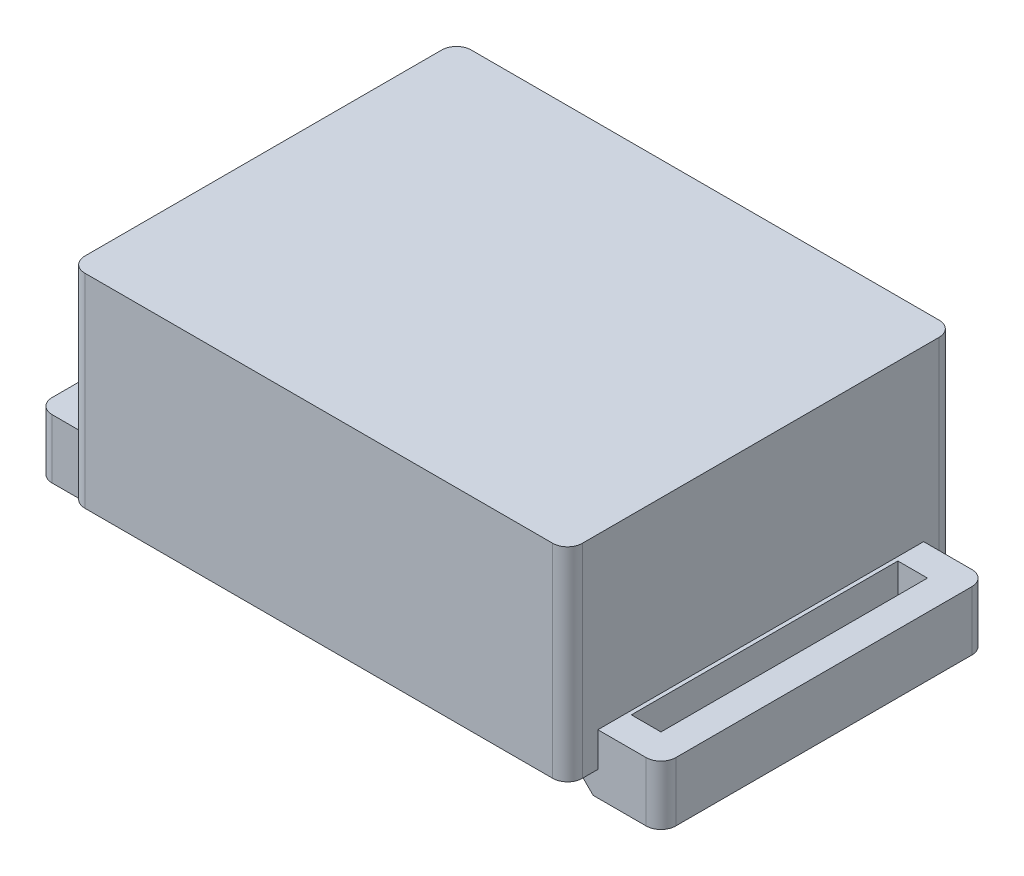
ISO-10303-21;
HEADER;
FILE_DESCRIPTION(('STEP AP214'),'2;1');
FILE_NAME('part.step','',(''),(''),'','','');
FILE_SCHEMA(('AUTOMOTIVE_DESIGN { 1 0 10303 214 1 1 1 1 }'));
ENDSEC;
DATA;
#1=APPLICATION_CONTEXT('core data for automotive mechanical design processes');
#2=APPLICATION_PROTOCOL_DEFINITION('international standard','automotive_design',2000,#1);
#3=PRODUCT_CONTEXT('',#1,'mechanical');
#4=PRODUCT('Part','Part','',(#3));
#5=PRODUCT_RELATED_PRODUCT_CATEGORY('part','',(#4));
#6=PRODUCT_DEFINITION_FORMATION('','',#4);
#7=PRODUCT_DEFINITION_CONTEXT('part definition',#1,'design');
#8=PRODUCT_DEFINITION('design','',#6,#7);
#9=PRODUCT_DEFINITION_SHAPE('','',#8);
#10=(LENGTH_UNIT() NAMED_UNIT(*) SI_UNIT(.MILLI.,.METRE.));
#11=(NAMED_UNIT(*) PLANE_ANGLE_UNIT() SI_UNIT($,.RADIAN.));
#12=(NAMED_UNIT(*) SI_UNIT($,.STERADIAN.) SOLID_ANGLE_UNIT());
#13=UNCERTAINTY_MEASURE_WITH_UNIT(LENGTH_MEASURE(1.E-05),#10,'distance_accuracy_value','');
#14=(GEOMETRIC_REPRESENTATION_CONTEXT(3) GLOBAL_UNCERTAINTY_ASSIGNED_CONTEXT((#13)) GLOBAL_UNIT_ASSIGNED_CONTEXT((#10,
#11,#12)) REPRESENTATION_CONTEXT('',''));
#15=CARTESIAN_POINT('',(0.,0.,0.));
#16=DIRECTION('',(0.,0.,1.));
#17=DIRECTION('',(1.,0.,0.));
#18=AXIS2_PLACEMENT_3D('',#15,#16,#17);
#19=CARTESIAN_POINT('',(-16.8,13.75,13.05));
#20=DIRECTION('',(1.,0.,0.));
#21=DIRECTION('',(0.,0.,-1.));
#22=AXIS2_PLACEMENT_3D('',#19,#20,#21);
#23=PLANE('',#22);
#24=DIRECTION('',(0.,0.,1.));
#25=VECTOR('',#24,1.);
#26=CARTESIAN_POINT('',(-16.8,13.75,13.05));
#27=LINE('',#26,#25);
#28=CARTESIAN_POINT('',(-16.8,13.75,-12.05));
#29=VERTEX_POINT('',#28);
#30=CARTESIAN_POINT('',(-16.8,13.75,12.05));
#31=VERTEX_POINT('',#30);
#32=EDGE_CURVE('E376',#29,#31,#27,.T.);
#33=ORIENTED_EDGE('',*,*,#32,.F.);
#34=DIRECTION('',(0.,-1.,0.));
#35=VECTOR('',#34,1.);
#36=CARTESIAN_POINT('',(-16.8,13.75,-12.05));
#37=LINE('',#36,#35);
#38=CARTESIAN_POINT('',(-16.8,0.,-12.05));
#39=VERTEX_POINT('',#38);
#40=EDGE_CURVE('E11',#29,#39,#37,.T.);
#41=ORIENTED_EDGE('',*,*,#40,.T.);
#42=DIRECTION('',(0.,0.,1.));
#43=VECTOR('',#42,1.);
#44=CARTESIAN_POINT('',(-16.8,0.,13.05));
#45=LINE('',#44,#43);
#46=CARTESIAN_POINT('',(-16.8,0.,-11.));
#47=VERTEX_POINT('',#46);
#48=EDGE_CURVE('E388',#39,#47,#45,.T.);
#49=ORIENTED_EDGE('',*,*,#48,.T.);
#50=DIRECTION('',(0.,-1.,0.));
#51=VECTOR('',#50,1.);
#52=CARTESIAN_POINT('',(-16.8,2.32,-11.));
#53=LINE('',#52,#51);
#54=CARTESIAN_POINT('',(-16.8,2.32,-11.));
#55=VERTEX_POINT('',#54);
#56=EDGE_CURVE('E291',#55,#47,#53,.T.);
#57=ORIENTED_EDGE('',*,*,#56,.F.);
#58=DIRECTION('',(0.,0.,-1.));
#59=VECTOR('',#58,1.);
#60=CARTESIAN_POINT('',(-16.8,2.32,11.));
#61=LINE('',#60,#59);
#62=CARTESIAN_POINT('',(-16.8,2.32,11.));
#63=VERTEX_POINT('',#62);
#64=EDGE_CURVE('E339',#63,#55,#61,.T.);
#65=ORIENTED_EDGE('',*,*,#64,.F.);
#66=DIRECTION('',(0.,-1.,0.));
#67=VECTOR('',#66,1.);
#68=CARTESIAN_POINT('',(-16.8,2.32,11.));
#69=LINE('',#68,#67);
#70=CARTESIAN_POINT('',(-16.8,0.,11.));
#71=VERTEX_POINT('',#70);
#72=EDGE_CURVE('E328',#63,#71,#69,.T.);
#73=ORIENTED_EDGE('',*,*,#72,.T.);
#74=CARTESIAN_POINT('',(-16.8,0.,12.05));
#75=VERTEX_POINT('',#74);
#76=EDGE_CURVE('E375',#71,#75,#45,.T.);
#77=ORIENTED_EDGE('',*,*,#76,.T.);
#78=DIRECTION('',(0.,-1.,0.));
#79=VECTOR('',#78,1.);
#80=CARTESIAN_POINT('',(-16.8,13.75,12.05));
#81=LINE('',#80,#79);
#82=EDGE_CURVE('E47',#75,#31,#81,.F.);
#83=ORIENTED_EDGE('',*,*,#82,.T.);
#84=EDGE_LOOP('',(#33,#41,#49,#57,#65,#73,#77,#83));
#85=FACE_BOUND('',#84,.T.);
#86=ADVANCED_FACE('F39',(#85),#23,.F.);
#87=CARTESIAN_POINT('',(16.8,13.75,13.05));
#88=DIRECTION('',(0.,0.,-1.));
#89=DIRECTION('',(-1.,0.,0.));
#90=AXIS2_PLACEMENT_3D('',#87,#88,#89);
#91=PLANE('',#90);
#92=DIRECTION('',(1.,0.,0.));
#93=VECTOR('',#92,1.);
#94=CARTESIAN_POINT('',(16.8,0.,13.05));
#95=LINE('',#94,#93);
#96=CARTESIAN_POINT('',(-15.8,0.,13.05));
#97=VERTEX_POINT('',#96);
#98=CARTESIAN_POINT('',(15.8,0.,13.05));
#99=VERTEX_POINT('',#98);
#100=EDGE_CURVE('E390',#97,#99,#95,.T.);
#101=ORIENTED_EDGE('',*,*,#100,.T.);
#102=DIRECTION('',(0.,-1.,0.));
#103=VECTOR('',#102,1.);
#104=CARTESIAN_POINT('',(15.8,13.75,13.05));
#105=LINE('',#104,#103);
#106=CARTESIAN_POINT('',(15.8,13.75,13.05));
#107=VERTEX_POINT('',#106);
#108=EDGE_CURVE('E482',#99,#107,#105,.F.);
#109=ORIENTED_EDGE('',*,*,#108,.T.);
#110=DIRECTION('',(1.,0.,0.));
#111=VECTOR('',#110,1.);
#112=CARTESIAN_POINT('',(16.8,13.75,13.05));
#113=LINE('',#112,#111);
#114=CARTESIAN_POINT('',(-15.8,13.75,13.05));
#115=VERTEX_POINT('',#114);
#116=EDGE_CURVE('E379',#115,#107,#113,.T.);
#117=ORIENTED_EDGE('',*,*,#116,.F.);
#118=DIRECTION('',(0.,-1.,0.));
#119=VECTOR('',#118,1.);
#120=CARTESIAN_POINT('',(-15.8,13.75,13.05));
#121=LINE('',#120,#119);
#122=EDGE_CURVE('E479',#115,#97,#121,.T.);
#123=ORIENTED_EDGE('',*,*,#122,.T.);
#124=EDGE_LOOP('',(#101,#109,#117,#123));
#125=FACE_BOUND('',#124,.T.);
#126=ADVANCED_FACE('F508',(#125),#91,.F.);
#127=CARTESIAN_POINT('',(16.8,13.75,13.05));
#128=DIRECTION('',(-1.,0.,0.));
#129=DIRECTION('',(0.,0.,1.));
#130=AXIS2_PLACEMENT_3D('',#127,#128,#129);
#131=PLANE('',#130);
#132=DIRECTION('',(0.,0.,-1.));
#133=VECTOR('',#132,1.);
#134=CARTESIAN_POINT('',(16.8,13.75,13.05));
#135=LINE('',#134,#133);
#136=CARTESIAN_POINT('',(16.8,13.75,12.05));
#137=VERTEX_POINT('',#136);
#138=CARTESIAN_POINT('',(16.8,13.75,-12.05));
#139=VERTEX_POINT('',#138);
#140=EDGE_CURVE('E383',#137,#139,#135,.T.);
#141=ORIENTED_EDGE('',*,*,#140,.F.);
#142=DIRECTION('',(0.,-1.,0.));
#143=VECTOR('',#142,1.);
#144=CARTESIAN_POINT('',(16.8,13.75,12.05));
#145=LINE('',#144,#143);
#146=CARTESIAN_POINT('',(16.8,0.,12.05));
#147=VERTEX_POINT('',#146);
#148=EDGE_CURVE('E468',#137,#147,#145,.T.);
#149=ORIENTED_EDGE('',*,*,#148,.T.);
#150=DIRECTION('',(0.,0.,-1.));
#151=VECTOR('',#150,1.);
#152=CARTESIAN_POINT('',(16.8,0.,13.05));
#153=LINE('',#152,#151);
#154=CARTESIAN_POINT('',(16.8,0.,11.));
#155=VERTEX_POINT('',#154);
#156=EDGE_CURVE('E394',#147,#155,#153,.T.);
#157=ORIENTED_EDGE('',*,*,#156,.T.);
#158=DIRECTION('',(0.,-1.,0.));
#159=VECTOR('',#158,1.);
#160=CARTESIAN_POINT('',(16.8,2.32,11.));
#161=LINE('',#160,#159);
#162=CARTESIAN_POINT('',(16.8,2.32,11.));
#163=VERTEX_POINT('',#162);
#164=EDGE_CURVE('E372',#163,#155,#161,.T.);
#165=ORIENTED_EDGE('',*,*,#164,.F.);
#166=DIRECTION('',(0.,0.,1.));
#167=VECTOR('',#166,1.);
#168=CARTESIAN_POINT('',(16.8,2.32,11.));
#169=LINE('',#168,#167);
#170=CARTESIAN_POINT('',(16.8,2.32,-11.));
#171=VERTEX_POINT('',#170);
#172=EDGE_CURVE('E358',#171,#163,#169,.T.);
#173=ORIENTED_EDGE('',*,*,#172,.F.);
#174=DIRECTION('',(0.,-1.,0.));
#175=VECTOR('',#174,1.);
#176=CARTESIAN_POINT('',(16.8,2.32,-11.));
#177=LINE('',#176,#175);
#178=CARTESIAN_POINT('',(16.8,0.,-11.));
#179=VERTEX_POINT('',#178);
#180=EDGE_CURVE('E369',#171,#179,#177,.T.);
#181=ORIENTED_EDGE('',*,*,#180,.T.);
#182=CARTESIAN_POINT('',(16.8,0.,-12.05));
#183=VERTEX_POINT('',#182);
#184=EDGE_CURVE('E393',#179,#183,#153,.T.);
#185=ORIENTED_EDGE('',*,*,#184,.T.);
#186=DIRECTION('',(0.,-1.,0.));
#187=VECTOR('',#186,1.);
#188=CARTESIAN_POINT('',(16.8,13.75,-12.05));
#189=LINE('',#188,#187);
#190=EDGE_CURVE('E466',#183,#139,#189,.F.);
#191=ORIENTED_EDGE('',*,*,#190,.T.);
#192=EDGE_LOOP('',(#141,#149,#157,#165,#173,#181,#185,#191));
#193=FACE_BOUND('',#192,.T.);
#194=ADVANCED_FACE('F519',(#193),#131,.F.);
#195=CARTESIAN_POINT('',(16.8,13.75,-13.05));
#196=DIRECTION('',(0.,0.,1.));
#197=DIRECTION('',(1.,0.,0.));
#198=AXIS2_PLACEMENT_3D('',#195,#196,#197);
#199=PLANE('',#198);
#200=DIRECTION('',(-1.,0.,0.));
#201=VECTOR('',#200,1.);
#202=CARTESIAN_POINT('',(16.8,13.75,-13.05));
#203=LINE('',#202,#201);
#204=CARTESIAN_POINT('',(15.8,13.75,-13.05));
#205=VERTEX_POINT('',#204);
#206=CARTESIAN_POINT('',(-15.8,13.75,-13.05));
#207=VERTEX_POINT('',#206);
#208=EDGE_CURVE('E385',#205,#207,#203,.T.);
#209=ORIENTED_EDGE('',*,*,#208,.F.);
#210=DIRECTION('',(0.,-1.,0.));
#211=VECTOR('',#210,1.);
#212=CARTESIAN_POINT('',(15.8,13.75,-13.05));
#213=LINE('',#212,#211);
#214=CARTESIAN_POINT('',(15.8,0.,-13.05));
#215=VERTEX_POINT('',#214);
#216=EDGE_CURVE('E492',#205,#215,#213,.T.);
#217=ORIENTED_EDGE('',*,*,#216,.T.);
#218=DIRECTION('',(-1.,0.,0.));
#219=VECTOR('',#218,1.);
#220=CARTESIAN_POINT('',(16.8,0.,-13.05));
#221=LINE('',#220,#219);
#222=CARTESIAN_POINT('',(-15.8,0.,-13.05));
#223=VERTEX_POINT('',#222);
#224=EDGE_CURVE('E380',#215,#223,#221,.T.);
#225=ORIENTED_EDGE('',*,*,#224,.T.);
#226=DIRECTION('',(0.,-1.,0.));
#227=VECTOR('',#226,1.);
#228=CARTESIAN_POINT('',(-15.8,13.75,-13.05));
#229=LINE('',#228,#227);
#230=EDGE_CURVE('E54',#223,#207,#229,.F.);
#231=ORIENTED_EDGE('',*,*,#230,.T.);
#232=EDGE_LOOP('',(#209,#217,#225,#231));
#233=FACE_BOUND('',#232,.T.);
#234=ADVANCED_FACE('F526',(#233),#199,.F.);
#235=CARTESIAN_POINT('',(0.,13.75,0.));
#236=DIRECTION('',(0.,1.,0.));
#237=DIRECTION('',(0.,0.,1.));
#238=AXIS2_PLACEMENT_3D('',#235,#236,#237);
#239=PLANE('',#238);
#240=ORIENTED_EDGE('',*,*,#116,.T.);
#241=CARTESIAN_POINT('',(15.8,13.75,12.05));
#242=DIRECTION('',(0.,1.,0.));
#243=DIRECTION('',(0.,0.,1.));
#244=AXIS2_PLACEMENT_3D('',#241,#242,#243);
#245=CIRCLE('',#244,1.);
#246=EDGE_CURVE('E489',#107,#137,#245,.T.);
#247=ORIENTED_EDGE('',*,*,#246,.T.);
#248=ORIENTED_EDGE('',*,*,#140,.T.);
#249=CARTESIAN_POINT('',(15.8,13.75,-12.05));
#250=DIRECTION('',(0.,1.,0.));
#251=DIRECTION('',(0.,0.,1.));
#252=AXIS2_PLACEMENT_3D('',#249,#250,#251);
#253=CIRCLE('',#252,1.);
#254=EDGE_CURVE('E61',#139,#205,#253,.T.);
#255=ORIENTED_EDGE('',*,*,#254,.T.);
#256=ORIENTED_EDGE('',*,*,#208,.T.);
#257=CARTESIAN_POINT('',(-15.8,13.75,-12.05));
#258=DIRECTION('',(0.,1.,0.));
#259=DIRECTION('',(0.,0.,1.));
#260=AXIS2_PLACEMENT_3D('',#257,#258,#259);
#261=CIRCLE('',#260,1.);
#262=EDGE_CURVE('E486',#207,#29,#261,.T.);
#263=ORIENTED_EDGE('',*,*,#262,.T.);
#264=ORIENTED_EDGE('',*,*,#32,.T.);
#265=CARTESIAN_POINT('',(-15.8,13.75,12.05));
#266=DIRECTION('',(0.,1.,0.));
#267=DIRECTION('',(0.,0.,1.));
#268=AXIS2_PLACEMENT_3D('',#265,#266,#267);
#269=CIRCLE('',#268,1.);
#270=EDGE_CURVE('E484',#31,#115,#269,.T.);
#271=ORIENTED_EDGE('',*,*,#270,.T.);
#272=EDGE_LOOP('',(#240,#247,#248,#255,#256,#263,#264,#271));
#273=FACE_BOUND('',#272,.T.);
#274=ADVANCED_FACE('F502',(#273),#239,.T.);
#275=CARTESIAN_POINT('',(0.,0.,0.));
#276=DIRECTION('',(0.,1.,0.));
#277=DIRECTION('',(0.,0.,1.));
#278=AXIS2_PLACEMENT_3D('',#275,#276,#277);
#279=PLANE('',#278);
#280=ORIENTED_EDGE('',*,*,#156,.F.);
#281=CARTESIAN_POINT('',(15.8,0.,12.05));
#282=DIRECTION('',(0.,1.,0.));
#283=DIRECTION('',(0.,0.,1.));
#284=AXIS2_PLACEMENT_3D('',#281,#282,#283);
#285=CIRCLE('',#284,1.);
#286=EDGE_CURVE('E477',#147,#99,#285,.F.);
#287=ORIENTED_EDGE('',*,*,#286,.T.);
#288=ORIENTED_EDGE('',*,*,#100,.F.);
#289=CARTESIAN_POINT('',(-15.8,0.,12.05));
#290=DIRECTION('',(0.,1.,0.));
#291=DIRECTION('',(0.,0.,1.));
#292=AXIS2_PLACEMENT_3D('',#289,#290,#291);
#293=CIRCLE('',#292,1.);
#294=EDGE_CURVE('E471',#97,#75,#293,.F.);
#295=ORIENTED_EDGE('',*,*,#294,.T.);
#296=ORIENTED_EDGE('',*,*,#76,.F.);
#297=DIRECTION('',(1.,0.,0.));
#298=VECTOR('',#297,1.);
#299=CARTESIAN_POINT('',(-21.06,0.,11.));
#300=LINE('',#299,#298);
#301=CARTESIAN_POINT('',(-14.8,0.,11.));
#302=VERTEX_POINT('',#301);
#303=EDGE_CURVE('E402',#71,#302,#300,.T.);
#304=ORIENTED_EDGE('',*,*,#303,.T.);
#305=DIRECTION('',(0.,0.,-1.));
#306=VECTOR('',#305,1.);
#307=CARTESIAN_POINT('',(-14.8,0.,-11.));
#308=LINE('',#307,#306);
#309=CARTESIAN_POINT('',(-14.8,0.,-11.));
#310=VERTEX_POINT('',#309);
#311=EDGE_CURVE('E399',#302,#310,#308,.T.);
#312=ORIENTED_EDGE('',*,*,#311,.T.);
#313=DIRECTION('',(-1.,0.,0.));
#314=VECTOR('',#313,1.);
#315=CARTESIAN_POINT('',(-21.06,0.,-11.));
#316=LINE('',#315,#314);
#317=EDGE_CURVE('E387',#310,#47,#316,.T.);
#318=ORIENTED_EDGE('',*,*,#317,.T.);
#319=ORIENTED_EDGE('',*,*,#48,.F.);
#320=CARTESIAN_POINT('',(-15.8,0.,-12.05));
#321=DIRECTION('',(0.,1.,0.));
#322=DIRECTION('',(0.,0.,1.));
#323=AXIS2_PLACEMENT_3D('',#320,#321,#322);
#324=CIRCLE('',#323,1.);
#325=EDGE_CURVE('E473',#39,#223,#324,.F.);
#326=ORIENTED_EDGE('',*,*,#325,.T.);
#327=ORIENTED_EDGE('',*,*,#224,.F.);
#328=CARTESIAN_POINT('',(15.8,0.,-12.05));
#329=DIRECTION('',(0.,1.,0.));
#330=DIRECTION('',(0.,0.,1.));
#331=AXIS2_PLACEMENT_3D('',#328,#329,#330);
#332=CIRCLE('',#331,1.);
#333=EDGE_CURVE('E475',#215,#183,#332,.F.);
#334=ORIENTED_EDGE('',*,*,#333,.T.);
#335=ORIENTED_EDGE('',*,*,#184,.F.);
#336=DIRECTION('',(-1.,0.,0.));
#337=VECTOR('',#336,1.);
#338=CARTESIAN_POINT('',(21.06,0.,-11.));
#339=LINE('',#338,#337);
#340=CARTESIAN_POINT('',(14.8,0.,-11.));
#341=VERTEX_POINT('',#340);
#342=EDGE_CURVE('E411',#179,#341,#339,.T.);
#343=ORIENTED_EDGE('',*,*,#342,.T.);
#344=DIRECTION('',(0.,0.,1.));
#345=VECTOR('',#344,1.);
#346=CARTESIAN_POINT('',(14.8,0.,11.));
#347=LINE('',#346,#345);
#348=CARTESIAN_POINT('',(14.8,0.,11.));
#349=VERTEX_POINT('',#348);
#350=EDGE_CURVE('E408',#341,#349,#347,.T.);
#351=ORIENTED_EDGE('',*,*,#350,.T.);
#352=DIRECTION('',(1.,0.,0.));
#353=VECTOR('',#352,1.);
#354=CARTESIAN_POINT('',(21.06,0.,11.));
#355=LINE('',#354,#353);
#356=EDGE_CURVE('E405',#349,#155,#355,.T.);
#357=ORIENTED_EDGE('',*,*,#356,.T.);
#358=EDGE_LOOP('',(#280,#287,#288,#295,#296,#304,#312,#318,#319,#326,#327,#334,#335,#343,#351,#357));
#359=FACE_BOUND('',#358,.T.);
#360=ADVANCED_FACE('F512',(#359),#279,.F.);
#361=CARTESIAN_POINT('',(21.06,2.32,11.));
#362=DIRECTION('',(0.,0.,-1.));
#363=DIRECTION('',(-1.,0.,0.));
#364=AXIS2_PLACEMENT_3D('',#361,#362,#363);
#365=PLANE('',#364);
#366=DIRECTION('',(1.,0.,0.));
#367=VECTOR('',#366,1.);
#368=CARTESIAN_POINT('',(21.06,-1.68,11.));
#369=LINE('',#368,#367);
#370=CARTESIAN_POINT('',(16.48,-1.68,11.));
#371=VERTEX_POINT('',#370);
#372=CARTESIAN_POINT('',(20.06,-1.68,11.));
#373=VERTEX_POINT('',#372);
#374=EDGE_CURVE('E350',#371,#373,#369,.T.);
#375=ORIENTED_EDGE('',*,*,#374,.T.);
#376=DIRECTION('',(0.,-1.,0.));
#377=VECTOR('',#376,1.);
#378=CARTESIAN_POINT('',(20.06,2.32,11.));
#379=LINE('',#378,#377);
#380=CARTESIAN_POINT('',(20.06,2.32,11.));
#381=VERTEX_POINT('',#380);
#382=EDGE_CURVE('E464',#373,#381,#379,.F.);
#383=ORIENTED_EDGE('',*,*,#382,.T.);
#384=DIRECTION('',(1.,0.,0.));
#385=VECTOR('',#384,1.);
#386=CARTESIAN_POINT('',(21.06,2.32,11.));
#387=LINE('',#386,#385);
#388=EDGE_CURVE('E361',#163,#381,#387,.T.);
#389=ORIENTED_EDGE('',*,*,#388,.F.);
#390=ORIENTED_EDGE('',*,*,#164,.T.);
#391=ORIENTED_EDGE('',*,*,#356,.F.);
#392=DIRECTION('',(-0.707106781186544,0.707106781186551,0.));
#393=VECTOR('',#392,1.);
#394=CARTESIAN_POINT('',(16.77,-1.96999999999999,11.));
#395=LINE('',#394,#393);
#396=EDGE_CURVE('E419',#349,#371,#395,.F.);
#397=ORIENTED_EDGE('',*,*,#396,.T.);
#398=EDGE_LOOP('',(#375,#383,#389,#390,#391,#397));
#399=FACE_BOUND('',#398,.T.);
#400=ADVANCED_FACE('F746',(#399),#365,.F.);
#401=CARTESIAN_POINT('',(21.06,2.32,11.));
#402=DIRECTION('',(-1.,0.,0.));
#403=DIRECTION('',(0.,0.,1.));
#404=AXIS2_PLACEMENT_3D('',#401,#402,#403);
#405=PLANE('',#404);
#406=DIRECTION('',(0.,0.,-1.));
#407=VECTOR('',#406,1.);
#408=CARTESIAN_POINT('',(21.06,-1.68,11.));
#409=LINE('',#408,#407);
#410=CARTESIAN_POINT('',(21.06,-1.68,10.));
#411=VERTEX_POINT('',#410);
#412=CARTESIAN_POINT('',(21.06,-1.68,-10.));
#413=VERTEX_POINT('',#412);
#414=EDGE_CURVE('E353',#411,#413,#409,.T.);
#415=ORIENTED_EDGE('',*,*,#414,.T.);
#416=DIRECTION('',(0.,-1.,0.));
#417=VECTOR('',#416,1.);
#418=CARTESIAN_POINT('',(21.06,2.32,-10.));
#419=LINE('',#418,#417);
#420=CARTESIAN_POINT('',(21.06,2.32,-10.));
#421=VERTEX_POINT('',#420);
#422=EDGE_CURVE('E458',#413,#421,#419,.F.);
#423=ORIENTED_EDGE('',*,*,#422,.T.);
#424=DIRECTION('',(0.,0.,-1.));
#425=VECTOR('',#424,1.);
#426=CARTESIAN_POINT('',(21.06,2.32,11.));
#427=LINE('',#426,#425);
#428=CARTESIAN_POINT('',(21.06,2.32,10.));
#429=VERTEX_POINT('',#428);
#430=EDGE_CURVE('E364',#429,#421,#427,.T.);
#431=ORIENTED_EDGE('',*,*,#430,.F.);
#432=DIRECTION('',(0.,-1.,0.));
#433=VECTOR('',#432,1.);
#434=CARTESIAN_POINT('',(21.06,2.32,10.));
#435=LINE('',#434,#433);
#436=EDGE_CURVE('E455',#429,#411,#435,.T.);
#437=ORIENTED_EDGE('',*,*,#436,.T.);
#438=EDGE_LOOP('',(#415,#423,#431,#437));
#439=FACE_BOUND('',#438,.T.);
#440=ADVANCED_FACE('F735',(#439),#405,.F.);
#441=CARTESIAN_POINT('',(21.06,2.32,-11.));
#442=DIRECTION('',(0.,0.,1.));
#443=DIRECTION('',(1.,0.,0.));
#444=AXIS2_PLACEMENT_3D('',#441,#442,#443);
#445=PLANE('',#444);
#446=DIRECTION('',(-1.,0.,0.));
#447=VECTOR('',#446,1.);
#448=CARTESIAN_POINT('',(21.06,2.32,-11.));
#449=LINE('',#448,#447);
#450=CARTESIAN_POINT('',(20.06,2.32,-11.));
#451=VERTEX_POINT('',#450);
#452=EDGE_CURVE('E367',#451,#171,#449,.T.);
#453=ORIENTED_EDGE('',*,*,#452,.F.);
#454=DIRECTION('',(0.,-1.,0.));
#455=VECTOR('',#454,1.);
#456=CARTESIAN_POINT('',(20.06,2.32,-11.));
#457=LINE('',#456,#455);
#458=CARTESIAN_POINT('',(20.06,-1.68,-11.));
#459=VERTEX_POINT('',#458);
#460=EDGE_CURVE('E448',#451,#459,#457,.T.);
#461=ORIENTED_EDGE('',*,*,#460,.T.);
#462=DIRECTION('',(-1.,0.,0.));
#463=VECTOR('',#462,1.);
#464=CARTESIAN_POINT('',(21.06,-1.68,-11.));
#465=LINE('',#464,#463);
#466=CARTESIAN_POINT('',(16.48,-1.68,-11.));
#467=VERTEX_POINT('',#466);
#468=EDGE_CURVE('E356',#459,#467,#465,.T.);
#469=ORIENTED_EDGE('',*,*,#468,.T.);
#470=DIRECTION('',(0.707106781186544,-0.707106781186551,0.));
#471=VECTOR('',#470,1.);
#472=CARTESIAN_POINT('',(16.77,-1.96999999999999,-11.));
#473=LINE('',#472,#471);
#474=EDGE_CURVE('E417',#467,#341,#473,.F.);
#475=ORIENTED_EDGE('',*,*,#474,.T.);
#476=ORIENTED_EDGE('',*,*,#342,.F.);
#477=ORIENTED_EDGE('',*,*,#180,.F.);
#478=EDGE_LOOP('',(#453,#461,#469,#475,#476,#477));
#479=FACE_BOUND('',#478,.T.);
#480=ADVANCED_FACE('F724',(#479),#445,.F.);
#481=CARTESIAN_POINT('',(0.,2.32,0.));
#482=DIRECTION('',(0.,1.,0.));
#483=DIRECTION('',(0.,0.,1.));
#484=AXIS2_PLACEMENT_3D('',#481,#482,#483);
#485=PLANE('',#484);
#486=DIRECTION('',(0.,0.,-1.));
#487=VECTOR('',#486,1.);
#488=CARTESIAN_POINT('',(19.06,2.32,-9.));
#489=LINE('',#488,#487);
#490=CARTESIAN_POINT('',(19.06,2.32,9.));
#491=VERTEX_POINT('',#490);
#492=CARTESIAN_POINT('',(19.06,2.32,-9.));
#493=VERTEX_POINT('',#492);
#494=EDGE_CURVE('E285',#491,#493,#489,.T.);
#495=ORIENTED_EDGE('',*,*,#494,.F.);
#496=DIRECTION('',(1.,0.,0.));
#497=VECTOR('',#496,1.);
#498=CARTESIAN_POINT('',(17.06,2.32,9.));
#499=LINE('',#498,#497);
#500=CARTESIAN_POINT('',(17.06,2.32,9.));
#501=VERTEX_POINT('',#500);
#502=EDGE_CURVE('E305',#501,#491,#499,.T.);
#503=ORIENTED_EDGE('',*,*,#502,.F.);
#504=DIRECTION('',(0.,0.,1.));
#505=VECTOR('',#504,1.);
#506=CARTESIAN_POINT('',(17.06,2.32,-9.));
#507=LINE('',#506,#505);
#508=CARTESIAN_POINT('',(17.06,2.32,-9.));
#509=VERTEX_POINT('',#508);
#510=EDGE_CURVE('E308',#509,#501,#507,.T.);
#511=ORIENTED_EDGE('',*,*,#510,.F.);
#512=DIRECTION('',(-1.,0.,0.));
#513=VECTOR('',#512,1.);
#514=CARTESIAN_POINT('',(17.06,2.32,-9.));
#515=LINE('',#514,#513);
#516=EDGE_CURVE('E312',#493,#509,#515,.T.);
#517=ORIENTED_EDGE('',*,*,#516,.F.);
#518=EDGE_LOOP('',(#495,#503,#511,#517));
#519=FACE_BOUND('',#518,.T.);
#520=ORIENTED_EDGE('',*,*,#430,.T.);
#521=CARTESIAN_POINT('',(20.06,2.32,-10.));
#522=DIRECTION('',(0.,1.,0.));
#523=DIRECTION('',(0.,0.,1.));
#524=AXIS2_PLACEMENT_3D('',#521,#522,#523);
#525=CIRCLE('',#524,1.);
#526=EDGE_CURVE('E462',#421,#451,#525,.T.);
#527=ORIENTED_EDGE('',*,*,#526,.T.);
#528=ORIENTED_EDGE('',*,*,#452,.T.);
#529=ORIENTED_EDGE('',*,*,#172,.T.);
#530=ORIENTED_EDGE('',*,*,#388,.T.);
#531=CARTESIAN_POINT('',(20.06,2.32,10.));
#532=DIRECTION('',(0.,1.,0.));
#533=DIRECTION('',(0.,0.,1.));
#534=AXIS2_PLACEMENT_3D('',#531,#532,#533);
#535=CIRCLE('',#534,1.);
#536=EDGE_CURVE('E460',#381,#429,#535,.T.);
#537=ORIENTED_EDGE('',*,*,#536,.T.);
#538=EDGE_LOOP('',(#520,#527,#528,#529,#530,#537));
#539=FACE_BOUND('',#538,.T.);
#540=ADVANCED_FACE('F714',(#519,#539),#485,.T.);
#541=CARTESIAN_POINT('',(0.,-1.68,0.));
#542=DIRECTION('',(0.,1.,0.));
#543=DIRECTION('',(0.,0.,1.));
#544=AXIS2_PLACEMENT_3D('',#541,#542,#543);
#545=PLANE('',#544);
#546=DIRECTION('',(1.,0.,0.));
#547=VECTOR('',#546,1.);
#548=CARTESIAN_POINT('',(17.06,-1.68,9.));
#549=LINE('',#548,#547);
#550=CARTESIAN_POINT('',(17.06,-1.68,9.));
#551=VERTEX_POINT('',#550);
#552=CARTESIAN_POINT('',(19.06,-1.68,9.));
#553=VERTEX_POINT('',#552);
#554=EDGE_CURVE('E298',#551,#553,#549,.T.);
#555=ORIENTED_EDGE('',*,*,#554,.T.);
#556=DIRECTION('',(0.,0.,-1.));
#557=VECTOR('',#556,1.);
#558=CARTESIAN_POINT('',(19.06,-1.68,-9.));
#559=LINE('',#558,#557);
#560=CARTESIAN_POINT('',(19.06,-1.68,-9.));
#561=VERTEX_POINT('',#560);
#562=EDGE_CURVE('E309',#553,#561,#559,.T.);
#563=ORIENTED_EDGE('',*,*,#562,.T.);
#564=DIRECTION('',(-1.,0.,0.));
#565=VECTOR('',#564,1.);
#566=CARTESIAN_POINT('',(17.06,-1.68,-9.));
#567=LINE('',#566,#565);
#568=CARTESIAN_POINT('',(17.06,-1.68,-9.));
#569=VERTEX_POINT('',#568);
#570=EDGE_CURVE('E321',#561,#569,#567,.T.);
#571=ORIENTED_EDGE('',*,*,#570,.T.);
#572=DIRECTION('',(0.,0.,1.));
#573=VECTOR('',#572,1.);
#574=CARTESIAN_POINT('',(17.06,-1.68,-9.));
#575=LINE('',#574,#573);
#576=EDGE_CURVE('E318',#569,#551,#575,.T.);
#577=ORIENTED_EDGE('',*,*,#576,.T.);
#578=EDGE_LOOP('',(#555,#563,#571,#577));
#579=FACE_BOUND('',#578,.T.);
#580=ORIENTED_EDGE('',*,*,#468,.F.);
#581=CARTESIAN_POINT('',(20.06,-1.68,-10.));
#582=DIRECTION('',(0.,1.,0.));
#583=DIRECTION('',(0.,0.,1.));
#584=AXIS2_PLACEMENT_3D('',#581,#582,#583);
#585=CIRCLE('',#584,1.);
#586=EDGE_CURVE('E453',#459,#413,#585,.F.);
#587=ORIENTED_EDGE('',*,*,#586,.T.);
#588=ORIENTED_EDGE('',*,*,#414,.F.);
#589=CARTESIAN_POINT('',(20.06,-1.68,10.));
#590=DIRECTION('',(0.,1.,0.));
#591=DIRECTION('',(0.,0.,1.));
#592=AXIS2_PLACEMENT_3D('',#589,#590,#591);
#593=CIRCLE('',#592,1.);
#594=EDGE_CURVE('E451',#411,#373,#593,.F.);
#595=ORIENTED_EDGE('',*,*,#594,.T.);
#596=ORIENTED_EDGE('',*,*,#374,.F.);
#597=DIRECTION('',(0.,0.,1.));
#598=VECTOR('',#597,1.);
#599=CARTESIAN_POINT('',(16.48,-1.68,0.));
#600=LINE('',#599,#598);
#601=EDGE_CURVE('E414',#371,#467,#600,.F.);
#602=ORIENTED_EDGE('',*,*,#601,.T.);
#603=EDGE_LOOP('',(#580,#587,#588,#595,#596,#602));
#604=FACE_BOUND('',#603,.T.);
#605=ADVANCED_FACE('F704',(#579,#604),#545,.F.);
#606=CARTESIAN_POINT('',(-21.06,2.32,-11.));
#607=DIRECTION('',(0.,0.,1.));
#608=DIRECTION('',(1.,0.,0.));
#609=AXIS2_PLACEMENT_3D('',#606,#607,#608);
#610=PLANE('',#609);
#611=DIRECTION('',(-1.,0.,0.));
#612=VECTOR('',#611,1.);
#613=CARTESIAN_POINT('',(-21.06,-1.68,-11.));
#614=LINE('',#613,#612);
#615=CARTESIAN_POINT('',(-16.48,-1.68,-11.));
#616=VERTEX_POINT('',#615);
#617=CARTESIAN_POINT('',(-20.06,-1.68,-11.));
#618=VERTEX_POINT('',#617);
#619=EDGE_CURVE('E347',#616,#618,#614,.T.);
#620=ORIENTED_EDGE('',*,*,#619,.T.);
#621=DIRECTION('',(0.,-1.,0.));
#622=VECTOR('',#621,1.);
#623=CARTESIAN_POINT('',(-20.06,2.32,-11.));
#624=LINE('',#623,#622);
#625=CARTESIAN_POINT('',(-20.06,2.32,-11.));
#626=VERTEX_POINT('',#625);
#627=EDGE_CURVE('E446',#618,#626,#624,.F.);
#628=ORIENTED_EDGE('',*,*,#627,.T.);
#629=DIRECTION('',(-1.,0.,0.));
#630=VECTOR('',#629,1.);
#631=CARTESIAN_POINT('',(-21.06,2.32,-11.));
#632=LINE('',#631,#630);
#633=EDGE_CURVE('E336',#55,#626,#632,.T.);
#634=ORIENTED_EDGE('',*,*,#633,.F.);
#635=ORIENTED_EDGE('',*,*,#56,.T.);
#636=ORIENTED_EDGE('',*,*,#317,.F.);
#637=DIRECTION('',(0.707106781186544,0.707106781186551,0.));
#638=VECTOR('',#637,1.);
#639=CARTESIAN_POINT('',(-16.77,-1.96999999999999,-11.));
#640=LINE('',#639,#638);
#641=EDGE_CURVE('E427',#310,#616,#640,.F.);
#642=ORIENTED_EDGE('',*,*,#641,.T.);
#643=EDGE_LOOP('',(#620,#628,#634,#635,#636,#642));
#644=FACE_BOUND('',#643,.T.);
#645=ADVANCED_FACE('F536',(#644),#610,.F.);
#646=CARTESIAN_POINT('',(-21.06,2.32,11.));
#647=DIRECTION('',(1.,0.,0.));
#648=DIRECTION('',(0.,0.,-1.));
#649=AXIS2_PLACEMENT_3D('',#646,#647,#648);
#650=PLANE('',#649);
#651=DIRECTION('',(0.,0.,1.));
#652=VECTOR('',#651,1.);
#653=CARTESIAN_POINT('',(-21.06,-1.68,11.));
#654=LINE('',#653,#652);
#655=CARTESIAN_POINT('',(-21.06,-1.68,-9.99999999999999));
#656=VERTEX_POINT('',#655);
#657=CARTESIAN_POINT('',(-21.06,-1.68,10.));
#658=VERTEX_POINT('',#657);
#659=EDGE_CURVE('E344',#656,#658,#654,.T.);
#660=ORIENTED_EDGE('',*,*,#659,.T.);
#661=DIRECTION('',(0.,-1.,0.));
#662=VECTOR('',#661,1.);
#663=CARTESIAN_POINT('',(-21.06,2.32,10.));
#664=LINE('',#663,#662);
#665=CARTESIAN_POINT('',(-21.06,2.32,10.));
#666=VERTEX_POINT('',#665);
#667=EDGE_CURVE('E440',#658,#666,#664,.F.);
#668=ORIENTED_EDGE('',*,*,#667,.T.);
#669=DIRECTION('',(0.,0.,1.));
#670=VECTOR('',#669,1.);
#671=CARTESIAN_POINT('',(-21.06,2.32,11.));
#672=LINE('',#671,#670);
#673=CARTESIAN_POINT('',(-21.06,2.32,-9.99999999999999));
#674=VERTEX_POINT('',#673);
#675=EDGE_CURVE('E333',#674,#666,#672,.T.);
#676=ORIENTED_EDGE('',*,*,#675,.F.);
#677=DIRECTION('',(0.,-1.,0.));
#678=VECTOR('',#677,1.);
#679=CARTESIAN_POINT('',(-21.06,2.32,-9.99999999999999));
#680=LINE('',#679,#678);
#681=EDGE_CURVE('E437',#674,#656,#680,.T.);
#682=ORIENTED_EDGE('',*,*,#681,.T.);
#683=EDGE_LOOP('',(#660,#668,#676,#682));
#684=FACE_BOUND('',#683,.T.);
#685=ADVANCED_FACE('F556',(#684),#650,.F.);
#686=CARTESIAN_POINT('',(-21.06,2.32,11.));
#687=DIRECTION('',(0.,0.,-1.));
#688=DIRECTION('',(-1.,0.,0.));
#689=AXIS2_PLACEMENT_3D('',#686,#687,#688);
#690=PLANE('',#689);
#691=DIRECTION('',(1.,0.,0.));
#692=VECTOR('',#691,1.);
#693=CARTESIAN_POINT('',(-21.06,2.32,11.));
#694=LINE('',#693,#692);
#695=CARTESIAN_POINT('',(-20.06,2.32,11.));
#696=VERTEX_POINT('',#695);
#697=EDGE_CURVE('E331',#696,#63,#694,.T.);
#698=ORIENTED_EDGE('',*,*,#697,.F.);
#699=DIRECTION('',(0.,-1.,0.));
#700=VECTOR('',#699,1.);
#701=CARTESIAN_POINT('',(-20.06,2.32,11.));
#702=LINE('',#701,#700);
#703=CARTESIAN_POINT('',(-20.06,-1.68,11.));
#704=VERTEX_POINT('',#703);
#705=EDGE_CURVE('E430',#696,#704,#702,.T.);
#706=ORIENTED_EDGE('',*,*,#705,.T.);
#707=DIRECTION('',(1.,0.,0.));
#708=VECTOR('',#707,1.);
#709=CARTESIAN_POINT('',(-21.06,-1.68,11.));
#710=LINE('',#709,#708);
#711=CARTESIAN_POINT('',(-16.48,-1.68,11.));
#712=VERTEX_POINT('',#711);
#713=EDGE_CURVE('E342',#704,#712,#710,.T.);
#714=ORIENTED_EDGE('',*,*,#713,.T.);
#715=DIRECTION('',(-0.707106781186544,-0.707106781186551,0.));
#716=VECTOR('',#715,1.);
#717=CARTESIAN_POINT('',(-16.77,-1.96999999999999,11.));
#718=LINE('',#717,#716);
#719=EDGE_CURVE('E425',#712,#302,#718,.F.);
#720=ORIENTED_EDGE('',*,*,#719,.T.);
#721=ORIENTED_EDGE('',*,*,#303,.F.);
#722=ORIENTED_EDGE('',*,*,#72,.F.);
#723=EDGE_LOOP('',(#698,#706,#714,#720,#721,#722));
#724=FACE_BOUND('',#723,.T.);
#725=ADVANCED_FACE('F544',(#724),#690,.F.);
#726=CARTESIAN_POINT('',(0.,2.32,0.));
#727=DIRECTION('',(0.,-1.,0.));
#728=DIRECTION('',(0.,0.,-1.));
#729=AXIS2_PLACEMENT_3D('',#726,#727,#728);
#730=PLANE('',#729);
#731=DIRECTION('',(-1.,0.,0.));
#732=VECTOR('',#731,1.);
#733=CARTESIAN_POINT('',(-17.0600000000001,2.32,-9.));
#734=LINE('',#733,#732);
#735=CARTESIAN_POINT('',(-17.0600000000001,2.32,-9.));
#736=VERTEX_POINT('',#735);
#737=CARTESIAN_POINT('',(-19.0600000000001,2.32,-9.));
#738=VERTEX_POINT('',#737);
#739=EDGE_CURVE('E284',#736,#738,#734,.T.);
#740=ORIENTED_EDGE('',*,*,#739,.F.);
#741=DIRECTION('',(0.,0.,-1.));
#742=VECTOR('',#741,1.);
#743=CARTESIAN_POINT('',(-17.0600000000001,2.32,-9.));
#744=LINE('',#743,#742);
#745=CARTESIAN_POINT('',(-17.0599999999999,2.32,9.00000000000022));
#746=VERTEX_POINT('',#745);
#747=EDGE_CURVE('E257',#746,#736,#744,.T.);
#748=ORIENTED_EDGE('',*,*,#747,.F.);
#749=DIRECTION('',(1.,0.,0.));
#750=VECTOR('',#749,1.);
#751=CARTESIAN_POINT('',(-17.0599999999999,2.32,9.00000000000022));
#752=LINE('',#751,#750);
#753=CARTESIAN_POINT('',(-19.0599999999999,2.32,9.00000000000022));
#754=VERTEX_POINT('',#753);
#755=EDGE_CURVE('E275',#754,#746,#752,.T.);
#756=ORIENTED_EDGE('',*,*,#755,.F.);
#757=DIRECTION('',(0.,0.,1.));
#758=VECTOR('',#757,1.);
#759=CARTESIAN_POINT('',(-19.0600000000001,2.32,-9.));
#760=LINE('',#759,#758);
#761=EDGE_CURVE('E278',#738,#754,#760,.T.);
#762=ORIENTED_EDGE('',*,*,#761,.F.);
#763=EDGE_LOOP('',(#740,#748,#756,#762));
#764=FACE_BOUND('',#763,.T.);
#765=ORIENTED_EDGE('',*,*,#675,.T.);
#766=CARTESIAN_POINT('',(-20.06,2.32,10.));
#767=DIRECTION('',(0.,-1.,0.));
#768=DIRECTION('',(0.,0.,-1.));
#769=AXIS2_PLACEMENT_3D('',#766,#767,#768);
#770=CIRCLE('',#769,1.);
#771=EDGE_CURVE('E444',#666,#696,#770,.F.);
#772=ORIENTED_EDGE('',*,*,#771,.T.);
#773=ORIENTED_EDGE('',*,*,#697,.T.);
#774=ORIENTED_EDGE('',*,*,#64,.T.);
#775=ORIENTED_EDGE('',*,*,#633,.T.);
#776=CARTESIAN_POINT('',(-20.06,2.32,-9.99999999999999));
#777=DIRECTION('',(0.,-1.,0.));
#778=DIRECTION('',(0.,0.,-1.));
#779=AXIS2_PLACEMENT_3D('',#776,#777,#778);
#780=CIRCLE('',#779,1.);
#781=EDGE_CURVE('E442',#626,#674,#780,.F.);
#782=ORIENTED_EDGE('',*,*,#781,.T.);
#783=EDGE_LOOP('',(#765,#772,#773,#774,#775,#782));
#784=FACE_BOUND('',#783,.T.);
#785=ADVANCED_FACE('F540',(#764,#784),#730,.F.);
#786=CARTESIAN_POINT('',(0.,-1.68,0.));
#787=DIRECTION('',(0.,-1.,0.));
#788=DIRECTION('',(0.,0.,-1.));
#789=AXIS2_PLACEMENT_3D('',#786,#787,#788);
#790=PLANE('',#789);
#791=DIRECTION('',(0.,0.,-1.));
#792=VECTOR('',#791,1.);
#793=CARTESIAN_POINT('',(-17.0600000000001,-1.68,-9.));
#794=LINE('',#793,#792);
#795=CARTESIAN_POINT('',(-17.0599999999999,-1.68,9.00000000000022));
#796=VERTEX_POINT('',#795);
#797=CARTESIAN_POINT('',(-17.0600000000001,-1.68,-9.));
#798=VERTEX_POINT('',#797);
#799=EDGE_CURVE('E254',#796,#798,#794,.T.);
#800=ORIENTED_EDGE('',*,*,#799,.T.);
#801=DIRECTION('',(-1.,0.,0.));
#802=VECTOR('',#801,1.);
#803=CARTESIAN_POINT('',(-17.0600000000001,-1.68,-9.));
#804=LINE('',#803,#802);
#805=CARTESIAN_POINT('',(-19.0600000000001,-1.68,-9.));
#806=VERTEX_POINT('',#805);
#807=EDGE_CURVE('E266',#798,#806,#804,.T.);
#808=ORIENTED_EDGE('',*,*,#807,.T.);
#809=DIRECTION('',(0.,0.,1.));
#810=VECTOR('',#809,1.);
#811=CARTESIAN_POINT('',(-19.0600000000001,-1.68,-9.));
#812=LINE('',#811,#810);
#813=CARTESIAN_POINT('',(-19.0599999999999,-1.68,9.00000000000022));
#814=VERTEX_POINT('',#813);
#815=EDGE_CURVE('E270',#806,#814,#812,.T.);
#816=ORIENTED_EDGE('',*,*,#815,.T.);
#817=DIRECTION('',(1.,0.,0.));
#818=VECTOR('',#817,1.);
#819=CARTESIAN_POINT('',(-17.0599999999999,-1.68,9.00000000000022));
#820=LINE('',#819,#818);
#821=EDGE_CURVE('E262',#814,#796,#820,.T.);
#822=ORIENTED_EDGE('',*,*,#821,.T.);
#823=EDGE_LOOP('',(#800,#808,#816,#822));
#824=FACE_BOUND('',#823,.T.);
#825=ORIENTED_EDGE('',*,*,#713,.F.);
#826=CARTESIAN_POINT('',(-20.06,-1.68,10.));
#827=DIRECTION('',(0.,-1.,0.));
#828=DIRECTION('',(0.,0.,-1.));
#829=AXIS2_PLACEMENT_3D('',#826,#827,#828);
#830=CIRCLE('',#829,1.);
#831=EDGE_CURVE('E435',#704,#658,#830,.T.);
#832=ORIENTED_EDGE('',*,*,#831,.T.);
#833=ORIENTED_EDGE('',*,*,#659,.F.);
#834=CARTESIAN_POINT('',(-20.06,-1.68,-9.99999999999999));
#835=DIRECTION('',(0.,-1.,0.));
#836=DIRECTION('',(0.,0.,-1.));
#837=AXIS2_PLACEMENT_3D('',#834,#835,#836);
#838=CIRCLE('',#837,1.);
#839=EDGE_CURVE('E433',#656,#618,#838,.T.);
#840=ORIENTED_EDGE('',*,*,#839,.T.);
#841=ORIENTED_EDGE('',*,*,#619,.F.);
#842=DIRECTION('',(0.,0.,-1.));
#843=VECTOR('',#842,1.);
#844=CARTESIAN_POINT('',(-16.48,-1.68,11.));
#845=LINE('',#844,#843);
#846=EDGE_CURVE('E422',#616,#712,#845,.F.);
#847=ORIENTED_EDGE('',*,*,#846,.T.);
#848=EDGE_LOOP('',(#825,#832,#833,#840,#841,#847));
#849=FACE_BOUND('',#848,.T.);
#850=ADVANCED_FACE('F272',(#824,#849),#790,.T.);
#851=CARTESIAN_POINT('',(-17.0600000000001,-1.68,-9.));
#852=DIRECTION('',(1.,0.,0.));
#853=DIRECTION('',(0.,0.,-1.));
#854=AXIS2_PLACEMENT_3D('',#851,#852,#853);
#855=PLANE('',#854);
#856=ORIENTED_EDGE('',*,*,#747,.T.);
#857=DIRECTION('',(0.,1.,0.));
#858=VECTOR('',#857,1.);
#859=CARTESIAN_POINT('',(-17.0600000000001,-1.68,-9.));
#860=LINE('',#859,#858);
#861=EDGE_CURVE('E250',#798,#736,#860,.T.);
#862=ORIENTED_EDGE('',*,*,#861,.F.);
#863=ORIENTED_EDGE('',*,*,#799,.F.);
#864=DIRECTION('',(0.,1.,0.));
#865=VECTOR('',#864,1.);
#866=CARTESIAN_POINT('',(-17.0599999999999,-1.68,9.00000000000022));
#867=LINE('',#866,#865);
#868=EDGE_CURVE('E289',#796,#746,#867,.T.);
#869=ORIENTED_EDGE('',*,*,#868,.T.);
#870=EDGE_LOOP('',(#856,#862,#863,#869));
#871=FACE_BOUND('',#870,.T.);
#872=ADVANCED_FACE('F252',(#871),#855,.F.);
#873=CARTESIAN_POINT('',(-17.0599999999999,-1.68,9.00000000000022));
#874=DIRECTION('',(0.,0.,1.));
#875=DIRECTION('',(1.,0.,0.));
#876=AXIS2_PLACEMENT_3D('',#873,#874,#875);
#877=PLANE('',#876);
#878=ORIENTED_EDGE('',*,*,#755,.T.);
#879=ORIENTED_EDGE('',*,*,#868,.F.);
#880=ORIENTED_EDGE('',*,*,#821,.F.);
#881=DIRECTION('',(0.,1.,0.));
#882=VECTOR('',#881,1.);
#883=CARTESIAN_POINT('',(-19.0599999999999,-1.68,9.00000000000022));
#884=LINE('',#883,#882);
#885=EDGE_CURVE('E292',#814,#754,#884,.T.);
#886=ORIENTED_EDGE('',*,*,#885,.T.);
#887=EDGE_LOOP('',(#878,#879,#880,#886));
#888=FACE_BOUND('',#887,.T.);
#889=ADVANCED_FACE('F568',(#888),#877,.F.);
#890=CARTESIAN_POINT('',(-19.0600000000001,-1.68,-9.));
#891=DIRECTION('',(-1.,0.,0.));
#892=DIRECTION('',(0.,0.,1.));
#893=AXIS2_PLACEMENT_3D('',#890,#891,#892);
#894=PLANE('',#893);
#895=ORIENTED_EDGE('',*,*,#761,.T.);
#896=ORIENTED_EDGE('',*,*,#885,.F.);
#897=ORIENTED_EDGE('',*,*,#815,.F.);
#898=DIRECTION('',(0.,1.,0.));
#899=VECTOR('',#898,1.);
#900=CARTESIAN_POINT('',(-19.0600000000001,-1.68,-9.));
#901=LINE('',#900,#899);
#902=EDGE_CURVE('E261',#806,#738,#901,.T.);
#903=ORIENTED_EDGE('',*,*,#902,.T.);
#904=EDGE_LOOP('',(#895,#896,#897,#903));
#905=FACE_BOUND('',#904,.T.);
#906=ADVANCED_FACE('F870',(#905),#894,.F.);
#907=CARTESIAN_POINT('',(-17.0600000000001,-1.68,-9.));
#908=DIRECTION('',(0.,0.,-1.));
#909=DIRECTION('',(-1.,0.,0.));
#910=AXIS2_PLACEMENT_3D('',#907,#908,#909);
#911=PLANE('',#910);
#912=ORIENTED_EDGE('',*,*,#739,.T.);
#913=ORIENTED_EDGE('',*,*,#902,.F.);
#914=ORIENTED_EDGE('',*,*,#807,.F.);
#915=ORIENTED_EDGE('',*,*,#861,.T.);
#916=EDGE_LOOP('',(#912,#913,#914,#915));
#917=FACE_BOUND('',#916,.T.);
#918=ADVANCED_FACE('F267',(#917),#911,.F.);
#919=CARTESIAN_POINT('',(19.06,-1.68,-9.));
#920=DIRECTION('',(1.,0.,0.));
#921=DIRECTION('',(0.,0.,-1.));
#922=AXIS2_PLACEMENT_3D('',#919,#920,#921);
#923=PLANE('',#922);
#924=ORIENTED_EDGE('',*,*,#494,.T.);
#925=DIRECTION('',(0.,1.,0.));
#926=VECTOR('',#925,1.);
#927=CARTESIAN_POINT('',(19.06,-1.68,-9.));
#928=LINE('',#927,#926);
#929=EDGE_CURVE('E295',#561,#493,#928,.T.);
#930=ORIENTED_EDGE('',*,*,#929,.F.);
#931=ORIENTED_EDGE('',*,*,#562,.F.);
#932=DIRECTION('',(0.,1.,0.));
#933=VECTOR('',#932,1.);
#934=CARTESIAN_POINT('',(19.06,-1.68,9.));
#935=LINE('',#934,#933);
#936=EDGE_CURVE('E303',#553,#491,#935,.T.);
#937=ORIENTED_EDGE('',*,*,#936,.T.);
#938=EDGE_LOOP('',(#924,#930,#931,#937));
#939=FACE_BOUND('',#938,.T.);
#940=ADVANCED_FACE('F849',(#939),#923,.F.);
#941=CARTESIAN_POINT('',(17.06,-1.68,9.));
#942=DIRECTION('',(0.,0.,1.));
#943=DIRECTION('',(1.,0.,0.));
#944=AXIS2_PLACEMENT_3D('',#941,#942,#943);
#945=PLANE('',#944);
#946=ORIENTED_EDGE('',*,*,#502,.T.);
#947=ORIENTED_EDGE('',*,*,#936,.F.);
#948=ORIENTED_EDGE('',*,*,#554,.F.);
#949=DIRECTION('',(0.,1.,0.));
#950=VECTOR('',#949,1.);
#951=CARTESIAN_POINT('',(17.06,-1.68,9.));
#952=LINE('',#951,#950);
#953=EDGE_CURVE('E301',#551,#501,#952,.T.);
#954=ORIENTED_EDGE('',*,*,#953,.T.);
#955=EDGE_LOOP('',(#946,#947,#948,#954));
#956=FACE_BOUND('',#955,.T.);
#957=ADVANCED_FACE('F838',(#956),#945,.F.);
#958=CARTESIAN_POINT('',(17.06,-1.68,-9.));
#959=DIRECTION('',(-1.,0.,0.));
#960=DIRECTION('',(0.,0.,1.));
#961=AXIS2_PLACEMENT_3D('',#958,#959,#960);
#962=PLANE('',#961);
#963=ORIENTED_EDGE('',*,*,#510,.T.);
#964=ORIENTED_EDGE('',*,*,#953,.F.);
#965=ORIENTED_EDGE('',*,*,#576,.F.);
#966=DIRECTION('',(0.,1.,0.));
#967=VECTOR('',#966,1.);
#968=CARTESIAN_POINT('',(17.06,-1.68,-9.));
#969=LINE('',#968,#967);
#970=EDGE_CURVE('E299',#569,#509,#969,.T.);
#971=ORIENTED_EDGE('',*,*,#970,.T.);
#972=EDGE_LOOP('',(#963,#964,#965,#971));
#973=FACE_BOUND('',#972,.T.);
#974=ADVANCED_FACE('F827',(#973),#962,.F.);
#975=CARTESIAN_POINT('',(17.06,-1.68,-9.));
#976=DIRECTION('',(0.,0.,-1.));
#977=DIRECTION('',(-1.,0.,0.));
#978=AXIS2_PLACEMENT_3D('',#975,#976,#977);
#979=PLANE('',#978);
#980=ORIENTED_EDGE('',*,*,#516,.T.);
#981=ORIENTED_EDGE('',*,*,#970,.F.);
#982=ORIENTED_EDGE('',*,*,#570,.F.);
#983=ORIENTED_EDGE('',*,*,#929,.T.);
#984=EDGE_LOOP('',(#980,#981,#982,#983));
#985=FACE_BOUND('',#984,.T.);
#986=ADVANCED_FACE('F588',(#985),#979,.F.);
#987=CARTESIAN_POINT('',(16.8,-2.00000000000004,11.));
#988=DIRECTION('',(-0.707106781186551,-0.707106781186544,0.));
#989=DIRECTION('',(0.,0.,1.));
#990=AXIS2_PLACEMENT_3D('',#987,#988,#989);
#991=PLANE('',#990);
#992=ORIENTED_EDGE('',*,*,#396,.F.);
#993=ORIENTED_EDGE('',*,*,#350,.F.);
#994=ORIENTED_EDGE('',*,*,#474,.F.);
#995=ORIENTED_EDGE('',*,*,#601,.F.);
#996=EDGE_LOOP('',(#992,#993,#994,#995));
#997=FACE_BOUND('',#996,.T.);
#998=ADVANCED_FACE('F582',(#997),#991,.T.);
#999=CARTESIAN_POINT('',(-16.8,-2.00000000000004,11.));
#1000=DIRECTION('',(0.707106781186551,-0.707106781186544,0.));
#1001=DIRECTION('',(0.,0.,-1.));
#1002=AXIS2_PLACEMENT_3D('',#999,#1000,#1001);
#1003=PLANE('',#1002);
#1004=ORIENTED_EDGE('',*,*,#641,.F.);
#1005=ORIENTED_EDGE('',*,*,#311,.F.);
#1006=ORIENTED_EDGE('',*,*,#719,.F.);
#1007=ORIENTED_EDGE('',*,*,#846,.F.);
#1008=EDGE_LOOP('',(#1004,#1005,#1006,#1007));
#1009=FACE_BOUND('',#1008,.T.);
#1010=ADVANCED_FACE('F548',(#1009),#1003,.T.);
#1011=CARTESIAN_POINT('',(-20.06,2.32,10.));
#1012=DIRECTION('',(0.,-1.,0.));
#1013=DIRECTION('',(0.,0.,-1.));
#1014=AXIS2_PLACEMENT_3D('',#1011,#1012,#1013);
#1015=CYLINDRICAL_SURFACE('',#1014,1.);
#1016=ORIENTED_EDGE('',*,*,#771,.F.);
#1017=ORIENTED_EDGE('',*,*,#667,.F.);
#1018=ORIENTED_EDGE('',*,*,#831,.F.);
#1019=ORIENTED_EDGE('',*,*,#705,.F.);
#1020=EDGE_LOOP('',(#1016,#1017,#1018,#1019));
#1021=FACE_BOUND('',#1020,.T.);
#1022=ADVANCED_FACE('F560',(#1021),#1015,.T.);
#1023=CARTESIAN_POINT('',(-20.06,2.32,-9.99999999999999));
#1024=DIRECTION('',(0.,-1.,0.));
#1025=DIRECTION('',(0.,0.,-1.));
#1026=AXIS2_PLACEMENT_3D('',#1023,#1024,#1025);
#1027=CYLINDRICAL_SURFACE('',#1026,1.);
#1028=ORIENTED_EDGE('',*,*,#781,.F.);
#1029=ORIENTED_EDGE('',*,*,#627,.F.);
#1030=ORIENTED_EDGE('',*,*,#839,.F.);
#1031=ORIENTED_EDGE('',*,*,#681,.F.);
#1032=EDGE_LOOP('',(#1028,#1029,#1030,#1031));
#1033=FACE_BOUND('',#1032,.T.);
#1034=ADVANCED_FACE('F551',(#1033),#1027,.T.);
#1035=CARTESIAN_POINT('',(20.06,2.32,-10.));
#1036=DIRECTION('',(0.,-1.,0.));
#1037=DIRECTION('',(0.,0.,-1.));
#1038=AXIS2_PLACEMENT_3D('',#1035,#1036,#1037);
#1039=CYLINDRICAL_SURFACE('',#1038,1.);
#1040=ORIENTED_EDGE('',*,*,#526,.F.);
#1041=ORIENTED_EDGE('',*,*,#422,.F.);
#1042=ORIENTED_EDGE('',*,*,#586,.F.);
#1043=ORIENTED_EDGE('',*,*,#460,.F.);
#1044=EDGE_LOOP('',(#1040,#1041,#1042,#1043));
#1045=FACE_BOUND('',#1044,.T.);
#1046=ADVANCED_FACE('F598',(#1045),#1039,.T.);
#1047=CARTESIAN_POINT('',(20.06,2.32,10.));
#1048=DIRECTION('',(0.,-1.,0.));
#1049=DIRECTION('',(0.,0.,-1.));
#1050=AXIS2_PLACEMENT_3D('',#1047,#1048,#1049);
#1051=CYLINDRICAL_SURFACE('',#1050,1.);
#1052=ORIENTED_EDGE('',*,*,#536,.F.);
#1053=ORIENTED_EDGE('',*,*,#382,.F.);
#1054=ORIENTED_EDGE('',*,*,#594,.F.);
#1055=ORIENTED_EDGE('',*,*,#436,.F.);
#1056=EDGE_LOOP('',(#1052,#1053,#1054,#1055));
#1057=FACE_BOUND('',#1056,.T.);
#1058=ADVANCED_FACE('F601',(#1057),#1051,.T.);
#1059=CARTESIAN_POINT('',(15.8,13.75,12.05));
#1060=DIRECTION('',(0.,-1.,0.));
#1061=DIRECTION('',(0.,0.,-1.));
#1062=AXIS2_PLACEMENT_3D('',#1059,#1060,#1061);
#1063=CYLINDRICAL_SURFACE('',#1062,1.);
#1064=ORIENTED_EDGE('',*,*,#246,.F.);
#1065=ORIENTED_EDGE('',*,*,#108,.F.);
#1066=ORIENTED_EDGE('',*,*,#286,.F.);
#1067=ORIENTED_EDGE('',*,*,#148,.F.);
#1068=EDGE_LOOP('',(#1064,#1065,#1066,#1067));
#1069=FACE_BOUND('',#1068,.T.);
#1070=ADVANCED_FACE('F516',(#1069),#1063,.T.);
#1071=CARTESIAN_POINT('',(15.8,13.75,-12.05));
#1072=DIRECTION('',(0.,-1.,0.));
#1073=DIRECTION('',(0.,0.,-1.));
#1074=AXIS2_PLACEMENT_3D('',#1071,#1072,#1073);
#1075=CYLINDRICAL_SURFACE('',#1074,1.);
#1076=ORIENTED_EDGE('',*,*,#254,.F.);
#1077=ORIENTED_EDGE('',*,*,#190,.F.);
#1078=ORIENTED_EDGE('',*,*,#333,.F.);
#1079=ORIENTED_EDGE('',*,*,#216,.F.);
#1080=EDGE_LOOP('',(#1076,#1077,#1078,#1079));
#1081=FACE_BOUND('',#1080,.T.);
#1082=ADVANCED_FACE('F524',(#1081),#1075,.T.);
#1083=CARTESIAN_POINT('',(-15.8,13.75,-12.05));
#1084=DIRECTION('',(0.,-1.,0.));
#1085=DIRECTION('',(0.,0.,-1.));
#1086=AXIS2_PLACEMENT_3D('',#1083,#1084,#1085);
#1087=CYLINDRICAL_SURFACE('',#1086,1.);
#1088=ORIENTED_EDGE('',*,*,#262,.F.);
#1089=ORIENTED_EDGE('',*,*,#230,.F.);
#1090=ORIENTED_EDGE('',*,*,#325,.F.);
#1091=ORIENTED_EDGE('',*,*,#40,.F.);
#1092=EDGE_LOOP('',(#1088,#1089,#1090,#1091));
#1093=FACE_BOUND('',#1092,.T.);
#1094=ADVANCED_FACE('F530',(#1093),#1087,.T.);
#1095=CARTESIAN_POINT('',(-15.8,13.75,12.05));
#1096=DIRECTION('',(0.,-1.,0.));
#1097=DIRECTION('',(0.,0.,-1.));
#1098=AXIS2_PLACEMENT_3D('',#1095,#1096,#1097);
#1099=CYLINDRICAL_SURFACE('',#1098,1.);
#1100=ORIENTED_EDGE('',*,*,#270,.F.);
#1101=ORIENTED_EDGE('',*,*,#82,.F.);
#1102=ORIENTED_EDGE('',*,*,#294,.F.);
#1103=ORIENTED_EDGE('',*,*,#122,.F.);
#1104=EDGE_LOOP('',(#1100,#1101,#1102,#1103));
#1105=FACE_BOUND('',#1104,.T.);
#1106=ADVANCED_FACE('F41',(#1105),#1099,.T.);
#1107=CLOSED_SHELL('',(#86,#126,#194,#234,#274,#360,#400,#440,#480,#540,#605,#645,#685,#725,
#785,#850,#872,#889,#906,#918,#940,#957,#974,#986,#998,#1010,#1022,#1034,#1046,#1058,#1070,
#1082,#1094,#1106));
#1108=MANIFOLD_SOLID_BREP('B2',#1107);
#1109=ADVANCED_BREP_SHAPE_REPRESENTATION('',(#18,#1108),#14);
#1110=SHAPE_DEFINITION_REPRESENTATION(#9,#1109);
ENDSEC;
END-ISO-10303-21;
